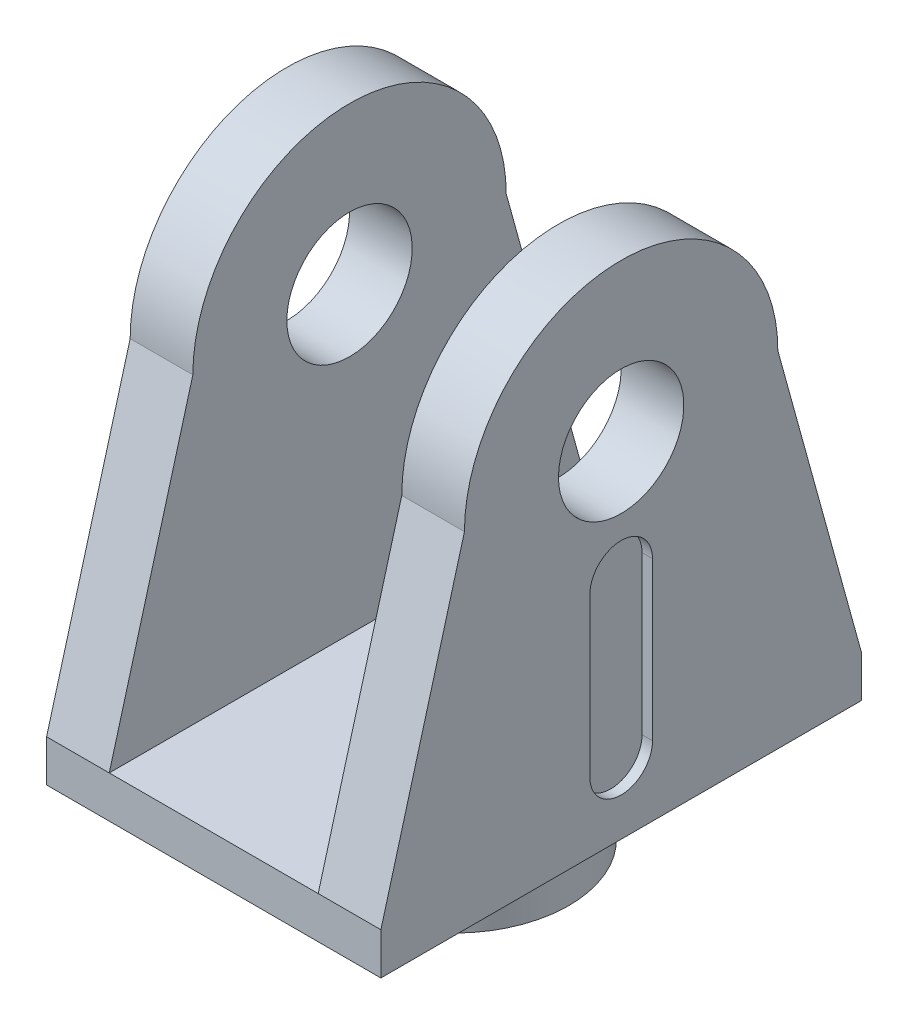
ISO-10303-21;
HEADER;
FILE_DESCRIPTION(('STEP AP214'),'2;1');
FILE_NAME('part.step','',(''),(''),'','','');
FILE_SCHEMA(('AUTOMOTIVE_DESIGN { 1 0 10303 214 1 1 1 1 }'));
ENDSEC;
DATA;
#1=APPLICATION_CONTEXT('core data for automotive mechanical design processes');
#2=APPLICATION_PROTOCOL_DEFINITION('international standard','automotive_design',2000,#1);
#3=PRODUCT_CONTEXT('',#1,'mechanical');
#4=PRODUCT('Part','Part','',(#3));
#5=PRODUCT_RELATED_PRODUCT_CATEGORY('part','',(#4));
#6=PRODUCT_DEFINITION_FORMATION('','',#4);
#7=PRODUCT_DEFINITION_CONTEXT('part definition',#1,'design');
#8=PRODUCT_DEFINITION('design','',#6,#7);
#9=PRODUCT_DEFINITION_SHAPE('','',#8);
#10=(LENGTH_UNIT() NAMED_UNIT(*) SI_UNIT(.MILLI.,.METRE.));
#11=(NAMED_UNIT(*) PLANE_ANGLE_UNIT() SI_UNIT($,.RADIAN.));
#12=(NAMED_UNIT(*) SI_UNIT($,.STERADIAN.) SOLID_ANGLE_UNIT());
#13=UNCERTAINTY_MEASURE_WITH_UNIT(LENGTH_MEASURE(1.E-05),#10,'distance_accuracy_value','');
#14=(GEOMETRIC_REPRESENTATION_CONTEXT(3) GLOBAL_UNCERTAINTY_ASSIGNED_CONTEXT((#13)) GLOBAL_UNIT_ASSIGNED_CONTEXT((#10,
#11,#12)) REPRESENTATION_CONTEXT('',''));
#15=CARTESIAN_POINT('',(0.,0.,0.));
#16=DIRECTION('',(0.,0.,1.));
#17=DIRECTION('',(1.,0.,0.));
#18=AXIS2_PLACEMENT_3D('',#15,#16,#17);
#19=CARTESIAN_POINT('',(80.,0.,115.));
#20=DIRECTION('',(-1.,0.,0.));
#21=DIRECTION('',(0.,0.,1.));
#22=AXIS2_PLACEMENT_3D('',#19,#20,#21);
#23=PLANE('',#22);
#24=CARTESIAN_POINT('',(80.,165.,0.));
#25=DIRECTION('',(-1.,0.,0.));
#26=DIRECTION('',(0.,0.,1.));
#27=AXIS2_PLACEMENT_3D('',#24,#25,#26);
#28=CIRCLE('',#27,75.);
#29=CARTESIAN_POINT('',(80.,165.,-75.));
#30=VERTEX_POINT('',#29);
#31=CARTESIAN_POINT('',(80.,165.,75.));
#32=VERTEX_POINT('',#31);
#33=EDGE_CURVE('E334',#30,#32,#28,.F.);
#34=ORIENTED_EDGE('',*,*,#33,.T.);
#35=DIRECTION('',(0.,0.963992618206074,-0.265928998125813));
#36=VECTOR('',#35,1.);
#37=CARTESIAN_POINT('',(80.,30.8950276243094,111.994475138122));
#38=LINE('',#37,#36);
#39=CARTESIAN_POINT('',(80.,20.,115.));
#40=VERTEX_POINT('',#39);
#41=EDGE_CURVE('E305',#40,#32,#38,.T.);
#42=ORIENTED_EDGE('',*,*,#41,.F.);
#43=DIRECTION('',(0.,1.,0.));
#44=VECTOR('',#43,1.);
#45=CARTESIAN_POINT('',(80.,0.,115.));
#46=LINE('',#45,#44);
#47=CARTESIAN_POINT('',(80.,0.,115.));
#48=VERTEX_POINT('',#47);
#49=EDGE_CURVE('E385',#48,#40,#46,.T.);
#50=ORIENTED_EDGE('',*,*,#49,.F.);
#51=DIRECTION('',(0.,0.,-1.));
#52=VECTOR('',#51,1.);
#53=CARTESIAN_POINT('',(80.,0.,115.));
#54=LINE('',#53,#52);
#55=CARTESIAN_POINT('',(80.,0.,-115.));
#56=VERTEX_POINT('',#55);
#57=EDGE_CURVE('E389',#48,#56,#54,.T.);
#58=ORIENTED_EDGE('',*,*,#57,.T.);
#59=DIRECTION('',(0.,1.,0.));
#60=VECTOR('',#59,1.);
#61=CARTESIAN_POINT('',(80.,0.,-115.));
#62=LINE('',#61,#60);
#63=CARTESIAN_POINT('',(80.,20.0000000000001,-115.));
#64=VERTEX_POINT('',#63);
#65=EDGE_CURVE('E379',#56,#64,#62,.T.);
#66=ORIENTED_EDGE('',*,*,#65,.T.);
#67=DIRECTION('',(0.,0.963992618206074,0.265928998125813));
#68=VECTOR('',#67,1.);
#69=CARTESIAN_POINT('',(80.,30.8950276243094,-111.994475138122));
#70=LINE('',#69,#68);
#71=EDGE_CURVE('E330',#64,#30,#70,.T.);
#72=ORIENTED_EDGE('',*,*,#71,.T.);
#73=EDGE_LOOP('',(#34,#42,#50,#58,#66,#72));
#74=FACE_BOUND('',#73,.T.);
#75=CARTESIAN_POINT('',(80.,165.,0.));
#76=DIRECTION('',(-1.,0.,0.));
#77=DIRECTION('',(0.,0.,1.));
#78=AXIS2_PLACEMENT_3D('',#75,#76,#77);
#79=CIRCLE('',#78,30.);
#80=CARTESIAN_POINT('',(80.,165.,30.));
#81=VERTEX_POINT('',#80);
#82=EDGE_CURVE('E293',#81,#81,#79,.F.);
#83=ORIENTED_EDGE('',*,*,#82,.F.);
#84=EDGE_LOOP('',(#83));
#85=FACE_BOUND('',#84,.T.);
#86=CARTESIAN_POINT('',(80.,108.832847002472,0.));
#87=DIRECTION('',(-1.,0.,0.));
#88=DIRECTION('',(0.,0.,1.));
#89=AXIS2_PLACEMENT_3D('',#86,#87,#88);
#90=CIRCLE('',#89,15.);
#91=CARTESIAN_POINT('',(80.,108.832847002472,15.));
#92=VERTEX_POINT('',#91);
#93=CARTESIAN_POINT('',(80.,108.832847002472,-15.));
#94=VERTEX_POINT('',#93);
#95=EDGE_CURVE('E88',#92,#94,#90,.T.);
#96=ORIENTED_EDGE('',*,*,#95,.T.);
#97=DIRECTION('',(0.,-1.,0.));
#98=VECTOR('',#97,1.);
#99=CARTESIAN_POINT('',(80.,108.832847002472,-15.));
#100=LINE('',#99,#98);
#101=CARTESIAN_POINT('',(80.,33.3521544358968,-15.));
#102=VERTEX_POINT('',#101);
#103=EDGE_CURVE('E220',#94,#102,#100,.T.);
#104=ORIENTED_EDGE('',*,*,#103,.T.);
#105=CARTESIAN_POINT('',(80.,33.3521544358968,0.));
#106=DIRECTION('',(-1.,0.,0.));
#107=DIRECTION('',(0.,0.,1.));
#108=AXIS2_PLACEMENT_3D('',#105,#106,#107);
#109=CIRCLE('',#108,15.);
#110=CARTESIAN_POINT('',(80.,33.3521544358968,15.));
#111=VERTEX_POINT('',#110);
#112=EDGE_CURVE('E224',#102,#111,#109,.T.);
#113=ORIENTED_EDGE('',*,*,#112,.T.);
#114=DIRECTION('',(0.,1.,0.));
#115=VECTOR('',#114,1.);
#116=CARTESIAN_POINT('',(80.,108.832847002472,15.));
#117=LINE('',#116,#115);
#118=EDGE_CURVE('E233',#111,#92,#117,.T.);
#119=ORIENTED_EDGE('',*,*,#118,.T.);
#120=EDGE_LOOP('',(#96,#104,#113,#119));
#121=FACE_BOUND('',#120,.T.);
#122=ADVANCED_FACE('F72',(#74,#85,#121),#23,.F.);
#123=CARTESIAN_POINT('',(50.,240.,115.));
#124=DIRECTION('',(1.,0.,0.));
#125=DIRECTION('',(0.,1.,0.));
#126=AXIS2_PLACEMENT_3D('',#123,#124,#125);
#127=PLANE('',#126);
#128=CARTESIAN_POINT('',(50.,165.,0.));
#129=DIRECTION('',(1.,0.,0.));
#130=DIRECTION('',(0.,1.,0.));
#131=AXIS2_PLACEMENT_3D('',#128,#129,#130);
#132=CIRCLE('',#131,30.);
#133=CARTESIAN_POINT('',(50.,195.,0.));
#134=VERTEX_POINT('',#133);
#135=EDGE_CURVE('E325',#134,#134,#132,.T.);
#136=ORIENTED_EDGE('',*,*,#135,.T.);
#137=EDGE_LOOP('',(#136));
#138=FACE_BOUND('',#137,.T.);
#139=DIRECTION('',(0.,0.963992618206074,-0.265928998125813));
#140=VECTOR('',#139,1.);
#141=CARTESIAN_POINT('',(50.,224.441988950276,58.6022099447514));
#142=LINE('',#141,#140);
#143=CARTESIAN_POINT('',(50.,20.,115.));
#144=VERTEX_POINT('',#143);
#145=CARTESIAN_POINT('',(50.,165.,75.));
#146=VERTEX_POINT('',#145);
#147=EDGE_CURVE('E317',#144,#146,#142,.T.);
#148=ORIENTED_EDGE('',*,*,#147,.T.);
#149=CARTESIAN_POINT('',(50.,165.,0.));
#150=DIRECTION('',(1.,0.,0.));
#151=DIRECTION('',(0.,1.,0.));
#152=AXIS2_PLACEMENT_3D('',#149,#150,#151);
#153=CIRCLE('',#152,75.);
#154=CARTESIAN_POINT('',(50.,165.,-75.));
#155=VERTEX_POINT('',#154);
#156=EDGE_CURVE('E361',#155,#146,#153,.T.);
#157=ORIENTED_EDGE('',*,*,#156,.F.);
#158=DIRECTION('',(0.,0.963992618206074,0.265928998125813));
#159=VECTOR('',#158,1.);
#160=CARTESIAN_POINT('',(50.,283.403314917127,-42.3370165745857));
#161=LINE('',#160,#159);
#162=CARTESIAN_POINT('',(50.,20.0000000000001,-115.));
#163=VERTEX_POINT('',#162);
#164=EDGE_CURVE('E355',#163,#155,#161,.T.);
#165=ORIENTED_EDGE('',*,*,#164,.F.);
#166=DIRECTION('',(0.,0.,-1.));
#167=VECTOR('',#166,1.);
#168=CARTESIAN_POINT('',(50.,20.,115.));
#169=LINE('',#168,#167);
#170=EDGE_CURVE('E373',#144,#163,#169,.T.);
#171=ORIENTED_EDGE('',*,*,#170,.F.);
#172=EDGE_LOOP('',(#148,#157,#165,#171));
#173=FACE_BOUND('',#172,.T.);
#174=ADVANCED_FACE('F74',(#138,#173),#127,.F.);
#175=CARTESIAN_POINT('',(-50.,240.,115.));
#176=DIRECTION('',(-1.,0.,0.));
#177=DIRECTION('',(0.,-1.,0.));
#178=AXIS2_PLACEMENT_3D('',#175,#176,#177);
#179=PLANE('',#178);
#180=CARTESIAN_POINT('',(-50.,165.,0.));
#181=DIRECTION('',(-1.,0.,0.));
#182=DIRECTION('',(0.,-1.,0.));
#183=AXIS2_PLACEMENT_3D('',#180,#181,#182);
#184=CIRCLE('',#183,30.);
#185=CARTESIAN_POINT('',(-50.,135.,0.));
#186=VERTEX_POINT('',#185);
#187=EDGE_CURVE('E321',#186,#186,#184,.T.);
#188=ORIENTED_EDGE('',*,*,#187,.T.);
#189=EDGE_LOOP('',(#188));
#190=FACE_BOUND('',#189,.T.);
#191=CARTESIAN_POINT('',(-50.,165.,0.));
#192=DIRECTION('',(-1.,0.,0.));
#193=DIRECTION('',(0.,-1.,0.));
#194=AXIS2_PLACEMENT_3D('',#191,#192,#193);
#195=CIRCLE('',#194,75.);
#196=CARTESIAN_POINT('',(-50.,165.,75.));
#197=VERTEX_POINT('',#196);
#198=CARTESIAN_POINT('',(-50.,165.,-75.));
#199=VERTEX_POINT('',#198);
#200=EDGE_CURVE('E358',#197,#199,#195,.T.);
#201=ORIENTED_EDGE('',*,*,#200,.F.);
#202=DIRECTION('',(0.,-0.963992618206074,0.265928998125813));
#203=VECTOR('',#202,1.);
#204=CARTESIAN_POINT('',(-50.,224.441988950276,58.6022099447514));
#205=LINE('',#204,#203);
#206=CARTESIAN_POINT('',(-50.,20.,115.));
#207=VERTEX_POINT('',#206);
#208=EDGE_CURVE('E313',#197,#207,#205,.T.);
#209=ORIENTED_EDGE('',*,*,#208,.T.);
#210=DIRECTION('',(0.,0.,-1.));
#211=VECTOR('',#210,1.);
#212=CARTESIAN_POINT('',(-50.,20.,115.));
#213=LINE('',#212,#211);
#214=CARTESIAN_POINT('',(-50.,20.,-115.));
#215=VERTEX_POINT('',#214);
#216=EDGE_CURVE('E409',#207,#215,#213,.T.);
#217=ORIENTED_EDGE('',*,*,#216,.T.);
#218=DIRECTION('',(0.,-0.963992618206074,-0.265928998125813));
#219=VECTOR('',#218,1.);
#220=CARTESIAN_POINT('',(-50.,283.403314917127,-42.3370165745857));
#221=LINE('',#220,#219);
#222=EDGE_CURVE('E338',#199,#215,#221,.T.);
#223=ORIENTED_EDGE('',*,*,#222,.F.);
#224=EDGE_LOOP('',(#201,#209,#217,#223));
#225=FACE_BOUND('',#224,.T.);
#226=ADVANCED_FACE('F456',(#190,#225),#179,.F.);
#227=CARTESIAN_POINT('',(-80.,0.,115.));
#228=DIRECTION('',(1.,0.,0.));
#229=DIRECTION('',(0.,0.,-1.));
#230=AXIS2_PLACEMENT_3D('',#227,#228,#229);
#231=PLANE('',#230);
#232=DIRECTION('',(0.,-1.,0.));
#233=VECTOR('',#232,1.);
#234=CARTESIAN_POINT('',(-80.,108.832847002472,-15.));
#235=LINE('',#234,#233);
#236=CARTESIAN_POINT('',(-80.,108.832847002472,-15.));
#237=VERTEX_POINT('',#236);
#238=CARTESIAN_POINT('',(-80.,33.3521544358968,-15.));
#239=VERTEX_POINT('',#238);
#240=EDGE_CURVE('E267',#237,#239,#235,.T.);
#241=ORIENTED_EDGE('',*,*,#240,.F.);
#242=CARTESIAN_POINT('',(-80.,108.832847002472,0.));
#243=DIRECTION('',(-1.,0.,0.));
#244=DIRECTION('',(0.,0.,1.));
#245=AXIS2_PLACEMENT_3D('',#242,#243,#244);
#246=CIRCLE('',#245,15.);
#247=CARTESIAN_POINT('',(-80.,108.832847002472,15.));
#248=VERTEX_POINT('',#247);
#249=EDGE_CURVE('E96',#248,#237,#246,.T.);
#250=ORIENTED_EDGE('',*,*,#249,.F.);
#251=DIRECTION('',(0.,1.,0.));
#252=VECTOR('',#251,1.);
#253=CARTESIAN_POINT('',(-80.,108.832847002472,15.));
#254=LINE('',#253,#252);
#255=CARTESIAN_POINT('',(-80.,33.3521544358968,15.));
#256=VERTEX_POINT('',#255);
#257=EDGE_CURVE('E252',#256,#248,#254,.T.);
#258=ORIENTED_EDGE('',*,*,#257,.F.);
#259=CARTESIAN_POINT('',(-80.,33.3521544358968,0.));
#260=DIRECTION('',(-1.,0.,0.));
#261=DIRECTION('',(0.,0.,1.));
#262=AXIS2_PLACEMENT_3D('',#259,#260,#261);
#263=CIRCLE('',#262,15.);
#264=EDGE_CURVE('E271',#239,#256,#263,.T.);
#265=ORIENTED_EDGE('',*,*,#264,.F.);
#266=EDGE_LOOP('',(#241,#250,#258,#265));
#267=FACE_BOUND('',#266,.T.);
#268=CARTESIAN_POINT('',(-80.,165.,0.));
#269=DIRECTION('',(-1.,0.,0.));
#270=DIRECTION('',(0.,0.,1.));
#271=AXIS2_PLACEMENT_3D('',#268,#269,#270);
#272=CIRCLE('',#271,30.);
#273=CARTESIAN_POINT('',(-80.,165.,30.));
#274=VERTEX_POINT('',#273);
#275=EDGE_CURVE('E281',#274,#274,#272,.T.);
#276=ORIENTED_EDGE('',*,*,#275,.F.);
#277=EDGE_LOOP('',(#276));
#278=FACE_BOUND('',#277,.T.);
#279=DIRECTION('',(0.,-0.963992618206074,0.265928998125813));
#280=VECTOR('',#279,1.);
#281=CARTESIAN_POINT('',(-80.,30.8950276243094,111.994475138122));
#282=LINE('',#281,#280);
#283=CARTESIAN_POINT('',(-80.,165.,75.));
#284=VERTEX_POINT('',#283);
#285=CARTESIAN_POINT('',(-80.,20.,115.));
#286=VERTEX_POINT('',#285);
#287=EDGE_CURVE('E297',#284,#286,#282,.T.);
#288=ORIENTED_EDGE('',*,*,#287,.F.);
#289=CARTESIAN_POINT('',(-80.,165.,0.));
#290=DIRECTION('',(-1.,0.,0.));
#291=DIRECTION('',(0.,0.,1.));
#292=AXIS2_PLACEMENT_3D('',#289,#290,#291);
#293=CIRCLE('',#292,75.);
#294=CARTESIAN_POINT('',(-80.,165.,-75.));
#295=VERTEX_POINT('',#294);
#296=EDGE_CURVE('E329',#284,#295,#293,.T.);
#297=ORIENTED_EDGE('',*,*,#296,.T.);
#298=DIRECTION('',(0.,-0.963992618206074,-0.265928998125813));
#299=VECTOR('',#298,1.);
#300=CARTESIAN_POINT('',(-80.,30.8950276243094,-111.994475138122));
#301=LINE('',#300,#299);
#302=CARTESIAN_POINT('',(-80.,20.0000000000001,-115.));
#303=VERTEX_POINT('',#302);
#304=EDGE_CURVE('E342',#295,#303,#301,.T.);
#305=ORIENTED_EDGE('',*,*,#304,.T.);
#306=DIRECTION('',(0.,-1.,0.));
#307=VECTOR('',#306,1.);
#308=CARTESIAN_POINT('',(-80.,0.,-115.));
#309=LINE('',#308,#307);
#310=CARTESIAN_POINT('',(-80.,0.,-115.));
#311=VERTEX_POINT('',#310);
#312=EDGE_CURVE('E393',#303,#311,#309,.T.);
#313=ORIENTED_EDGE('',*,*,#312,.T.);
#314=DIRECTION('',(0.,0.,-1.));
#315=VECTOR('',#314,1.);
#316=CARTESIAN_POINT('',(-80.,0.,115.));
#317=LINE('',#316,#315);
#318=CARTESIAN_POINT('',(-80.,0.,115.));
#319=VERTEX_POINT('',#318);
#320=EDGE_CURVE('E405',#319,#311,#317,.T.);
#321=ORIENTED_EDGE('',*,*,#320,.F.);
#322=DIRECTION('',(0.,-1.,0.));
#323=VECTOR('',#322,1.);
#324=CARTESIAN_POINT('',(-80.,0.,115.));
#325=LINE('',#324,#323);
#326=EDGE_CURVE('E378',#286,#319,#325,.T.);
#327=ORIENTED_EDGE('',*,*,#326,.F.);
#328=EDGE_LOOP('',(#288,#297,#305,#313,#321,#327));
#329=FACE_BOUND('',#328,.T.);
#330=ADVANCED_FACE('F427',(#267,#278,#329),#231,.F.);
#331=CARTESIAN_POINT('',(0.,0.,-115.));
#332=DIRECTION('',(0.,0.,1.));
#333=DIRECTION('',(1.,0.,0.));
#334=AXIS2_PLACEMENT_3D('',#331,#332,#333);
#335=PLANE('',#334);
#336=DIRECTION('',(-1.,0.,0.));
#337=VECTOR('',#336,1.);
#338=CARTESIAN_POINT('',(328.243831746128,20.0000000000001,-115.));
#339=LINE('',#338,#337);
#340=EDGE_CURVE('E346',#64,#163,#339,.T.);
#341=ORIENTED_EDGE('',*,*,#340,.F.);
#342=ORIENTED_EDGE('',*,*,#65,.F.);
#343=DIRECTION('',(1.,0.,0.));
#344=VECTOR('',#343,1.);
#345=CARTESIAN_POINT('',(80.,0.,-115.));
#346=LINE('',#345,#344);
#347=EDGE_CURVE('E396',#311,#56,#346,.T.);
#348=ORIENTED_EDGE('',*,*,#347,.F.);
#349=ORIENTED_EDGE('',*,*,#312,.F.);
#350=DIRECTION('',(-1.,0.,0.));
#351=VECTOR('',#350,1.);
#352=CARTESIAN_POINT('',(0.,20.,-115.));
#353=LINE('',#352,#351);
#354=EDGE_CURVE('E81',#215,#303,#353,.T.);
#355=ORIENTED_EDGE('',*,*,#354,.F.);
#356=DIRECTION('',(-1.,0.,0.));
#357=VECTOR('',#356,1.);
#358=CARTESIAN_POINT('',(-50.,20.,-115.));
#359=LINE('',#358,#357);
#360=EDGE_CURVE('E368',#163,#215,#359,.T.);
#361=ORIENTED_EDGE('',*,*,#360,.F.);
#362=EDGE_LOOP('',(#341,#342,#348,#349,#355,#361));
#363=FACE_BOUND('',#362,.T.);
#364=ADVANCED_FACE('F431',(#363),#335,.F.);
#365=CARTESIAN_POINT('',(-50.,20.,115.));
#366=DIRECTION('',(0.,-1.,0.));
#367=DIRECTION('',(0.,0.,-1.));
#368=AXIS2_PLACEMENT_3D('',#365,#366,#367);
#369=PLANE('',#368);
#370=ORIENTED_EDGE('',*,*,#360,.T.);
#371=ORIENTED_EDGE('',*,*,#216,.F.);
#372=DIRECTION('',(-1.,0.,0.));
#373=VECTOR('',#372,1.);
#374=CARTESIAN_POINT('',(-50.,20.,115.));
#375=LINE('',#374,#373);
#376=EDGE_CURVE('E374',#144,#207,#375,.T.);
#377=ORIENTED_EDGE('',*,*,#376,.F.);
#378=ORIENTED_EDGE('',*,*,#170,.T.);
#379=EDGE_LOOP('',(#370,#371,#377,#378));
#380=FACE_BOUND('',#379,.T.);
#381=ADVANCED_FACE('F459',(#380),#369,.F.);
#382=CARTESIAN_POINT('',(80.,0.,115.));
#383=DIRECTION('',(0.,1.,0.));
#384=DIRECTION('',(0.,0.,1.));
#385=AXIS2_PLACEMENT_3D('',#382,#383,#384);
#386=PLANE('',#385);
#387=CARTESIAN_POINT('',(0.,0.,0.));
#388=DIRECTION('',(0.,-1.,0.));
#389=DIRECTION('',(0.,0.,-1.));
#390=AXIS2_PLACEMENT_3D('',#387,#388,#389);
#391=CIRCLE('',#390,55.);
#392=CARTESIAN_POINT('',(0.,0.,-55.));
#393=VERTEX_POINT('',#392);
#394=EDGE_CURVE('E369',#393,#393,#391,.T.);
#395=ORIENTED_EDGE('',*,*,#394,.F.);
#396=EDGE_LOOP('',(#395));
#397=FACE_BOUND('',#396,.T.);
#398=ORIENTED_EDGE('',*,*,#347,.T.);
#399=ORIENTED_EDGE('',*,*,#57,.F.);
#400=DIRECTION('',(1.,0.,0.));
#401=VECTOR('',#400,1.);
#402=CARTESIAN_POINT('',(80.,0.,115.));
#403=LINE('',#402,#401);
#404=EDGE_CURVE('E382',#319,#48,#403,.T.);
#405=ORIENTED_EDGE('',*,*,#404,.F.);
#406=ORIENTED_EDGE('',*,*,#320,.T.);
#407=EDGE_LOOP('',(#398,#399,#405,#406));
#408=FACE_BOUND('',#407,.T.);
#409=ADVANCED_FACE('F435',(#397,#408),#386,.F.);
#410=CARTESIAN_POINT('',(0.,0.,115.));
#411=DIRECTION('',(0.,0.,1.));
#412=DIRECTION('',(1.,0.,0.));
#413=AXIS2_PLACEMENT_3D('',#410,#411,#412);
#414=PLANE('',#413);
#415=DIRECTION('',(1.,0.,0.));
#416=VECTOR('',#415,1.);
#417=CARTESIAN_POINT('',(0.,19.9999999999999,115.));
#418=LINE('',#417,#416);
#419=EDGE_CURVE('E12',#286,#207,#418,.T.);
#420=ORIENTED_EDGE('',*,*,#419,.F.);
#421=ORIENTED_EDGE('',*,*,#326,.T.);
#422=ORIENTED_EDGE('',*,*,#404,.T.);
#423=ORIENTED_EDGE('',*,*,#49,.T.);
#424=DIRECTION('',(-1.,0.,0.));
#425=VECTOR('',#424,1.);
#426=CARTESIAN_POINT('',(328.243831746128,20.,115.));
#427=LINE('',#426,#425);
#428=EDGE_CURVE('E301',#40,#144,#427,.T.);
#429=ORIENTED_EDGE('',*,*,#428,.T.);
#430=ORIENTED_EDGE('',*,*,#376,.T.);
#431=EDGE_LOOP('',(#420,#421,#422,#423,#429,#430));
#432=FACE_BOUND('',#431,.T.);
#433=ADVANCED_FACE('F443',(#432),#414,.T.);
#434=CARTESIAN_POINT('',(0.,-40.,0.));
#435=DIRECTION('',(0.,1.,0.));
#436=DIRECTION('',(0.,0.,1.));
#437=AXIS2_PLACEMENT_3D('',#434,#435,#436);
#438=CYLINDRICAL_SURFACE('',#437,55.);
#439=CARTESIAN_POINT('',(0.,-40.,0.));
#440=DIRECTION('',(0.,-1.,0.));
#441=DIRECTION('',(0.,0.,-1.));
#442=AXIS2_PLACEMENT_3D('',#439,#440,#441);
#443=CIRCLE('',#442,55.);
#444=CARTESIAN_POINT('',(0.,-40.,-55.));
#445=VERTEX_POINT('',#444);
#446=EDGE_CURVE('E364',#445,#445,#443,.T.);
#447=ORIENTED_EDGE('',*,*,#446,.F.);
#448=EDGE_LOOP('',(#447));
#449=FACE_BOUND('',#448,.T.);
#450=ORIENTED_EDGE('',*,*,#394,.T.);
#451=EDGE_LOOP('',(#450));
#452=FACE_BOUND('',#451,.T.);
#453=ADVANCED_FACE('F535',(#449,#452),#438,.T.);
#454=CARTESIAN_POINT('',(0.,-40.,0.));
#455=DIRECTION('',(0.,-1.,0.));
#456=DIRECTION('',(0.,0.,-1.));
#457=AXIS2_PLACEMENT_3D('',#454,#455,#456);
#458=PLANE('',#457);
#459=ORIENTED_EDGE('',*,*,#446,.T.);
#460=EDGE_LOOP('',(#459));
#461=FACE_BOUND('',#460,.T.);
#462=ADVANCED_FACE('F530',(#461),#458,.T.);
#463=CARTESIAN_POINT('',(328.243831746128,30.8950276243094,-111.994475138122));
#464=DIRECTION('',(0.,0.265928998125813,-0.963992618206074));
#465=DIRECTION('',(0.,0.963992618206074,0.265928998125813));
#466=AXIS2_PLACEMENT_3D('',#463,#464,#465);
#467=PLANE('',#466);
#468=ORIENTED_EDGE('',*,*,#222,.T.);
#469=ORIENTED_EDGE('',*,*,#354,.T.);
#470=ORIENTED_EDGE('',*,*,#304,.F.);
#471=DIRECTION('',(-1.,0.,0.));
#472=VECTOR('',#471,1.);
#473=CARTESIAN_POINT('',(328.243831746128,165.,-75.));
#474=LINE('',#473,#472);
#475=EDGE_CURVE('E350',#199,#295,#474,.T.);
#476=ORIENTED_EDGE('',*,*,#475,.F.);
#477=EDGE_LOOP('',(#468,#469,#470,#476));
#478=FACE_BOUND('',#477,.T.);
#479=ADVANCED_FACE('F419',(#478),#467,.T.);
#480=CARTESIAN_POINT('',(328.243831746128,165.,0.));
#481=DIRECTION('',(-1.,0.,0.));
#482=DIRECTION('',(0.,0.,1.));
#483=AXIS2_PLACEMENT_3D('',#480,#481,#482);
#484=CYLINDRICAL_SURFACE('',#483,75.);
#485=ORIENTED_EDGE('',*,*,#200,.T.);
#486=ORIENTED_EDGE('',*,*,#475,.T.);
#487=ORIENTED_EDGE('',*,*,#296,.F.);
#488=DIRECTION('',(-1.,0.,0.));
#489=VECTOR('',#488,1.);
#490=CARTESIAN_POINT('',(328.243831746128,165.,75.));
#491=LINE('',#490,#489);
#492=EDGE_CURVE('E300',#197,#284,#491,.T.);
#493=ORIENTED_EDGE('',*,*,#492,.F.);
#494=EDGE_LOOP('',(#485,#486,#487,#493));
#495=FACE_BOUND('',#494,.T.);
#496=ADVANCED_FACE('F454',(#495),#484,.T.);
#497=ORIENTED_EDGE('',*,*,#156,.T.);
#498=EDGE_CURVE('E306',#32,#146,#491,.T.);
#499=ORIENTED_EDGE('',*,*,#498,.F.);
#500=ORIENTED_EDGE('',*,*,#33,.F.);
#501=EDGE_CURVE('E335',#30,#155,#474,.T.);
#502=ORIENTED_EDGE('',*,*,#501,.T.);
#503=EDGE_LOOP('',(#497,#499,#500,#502));
#504=FACE_BOUND('',#503,.T.);
#505=ADVANCED_FACE('F469',(#504),#484,.T.);
#506=ORIENTED_EDGE('',*,*,#164,.T.);
#507=ORIENTED_EDGE('',*,*,#501,.F.);
#508=ORIENTED_EDGE('',*,*,#71,.F.);
#509=ORIENTED_EDGE('',*,*,#340,.T.);
#510=EDGE_LOOP('',(#506,#507,#508,#509));
#511=FACE_BOUND('',#510,.T.);
#512=ADVANCED_FACE('F463',(#511),#467,.T.);
#513=CARTESIAN_POINT('',(328.243831746128,30.8950276243094,111.994475138122));
#514=DIRECTION('',(0.,-0.265928998125813,-0.963992618206074));
#515=DIRECTION('',(0.,0.963992618206074,-0.265928998125813));
#516=AXIS2_PLACEMENT_3D('',#513,#514,#515);
#517=PLANE('',#516);
#518=ORIENTED_EDGE('',*,*,#428,.F.);
#519=ORIENTED_EDGE('',*,*,#41,.T.);
#520=ORIENTED_EDGE('',*,*,#498,.T.);
#521=ORIENTED_EDGE('',*,*,#147,.F.);
#522=EDGE_LOOP('',(#518,#519,#520,#521));
#523=FACE_BOUND('',#522,.T.);
#524=ADVANCED_FACE('F471',(#523),#517,.F.);
#525=ORIENTED_EDGE('',*,*,#492,.T.);
#526=ORIENTED_EDGE('',*,*,#287,.T.);
#527=ORIENTED_EDGE('',*,*,#419,.T.);
#528=ORIENTED_EDGE('',*,*,#208,.F.);
#529=EDGE_LOOP('',(#525,#526,#527,#528));
#530=FACE_BOUND('',#529,.T.);
#531=ADVANCED_FACE('F448',(#530),#517,.F.);
#532=CARTESIAN_POINT('',(328.243831746128,165.,0.));
#533=DIRECTION('',(-1.,0.,0.));
#534=DIRECTION('',(0.,0.,1.));
#535=AXIS2_PLACEMENT_3D('',#532,#533,#534);
#536=CYLINDRICAL_SURFACE('',#535,30.);
#537=ORIENTED_EDGE('',*,*,#82,.T.);
#538=EDGE_LOOP('',(#537));
#539=FACE_BOUND('',#538,.T.);
#540=ORIENTED_EDGE('',*,*,#135,.F.);
#541=EDGE_LOOP('',(#540));
#542=FACE_BOUND('',#541,.T.);
#543=ADVANCED_FACE('F478',(#539,#542),#536,.F.);
#544=ORIENTED_EDGE('',*,*,#275,.T.);
#545=EDGE_LOOP('',(#544));
#546=FACE_BOUND('',#545,.T.);
#547=ORIENTED_EDGE('',*,*,#187,.F.);
#548=EDGE_LOOP('',(#547));
#549=FACE_BOUND('',#548,.T.);
#550=ADVANCED_FACE('F615',(#546,#549),#536,.F.);
#551=CARTESIAN_POINT('',(-75.,108.832847002472,0.));
#552=DIRECTION('',(-1.,0.,0.));
#553=DIRECTION('',(0.,0.,1.));
#554=AXIS2_PLACEMENT_3D('',#551,#552,#553);
#555=CYLINDRICAL_SURFACE('',#554,15.);
#556=ORIENTED_EDGE('',*,*,#249,.T.);
#557=DIRECTION('',(-1.,0.,0.));
#558=VECTOR('',#557,1.);
#559=CARTESIAN_POINT('',(-75.,108.832847002472,-15.));
#560=LINE('',#559,#558);
#561=CARTESIAN_POINT('',(-75.,108.832847002472,-15.));
#562=VERTEX_POINT('',#561);
#563=EDGE_CURVE('E264',#562,#237,#560,.T.);
#564=ORIENTED_EDGE('',*,*,#563,.F.);
#565=CARTESIAN_POINT('',(-75.,108.832847002472,0.));
#566=DIRECTION('',(-1.,0.,0.));
#567=DIRECTION('',(0.,0.,1.));
#568=AXIS2_PLACEMENT_3D('',#565,#566,#567);
#569=CIRCLE('',#568,15.);
#570=CARTESIAN_POINT('',(-75.,108.832847002472,15.));
#571=VERTEX_POINT('',#570);
#572=EDGE_CURVE('E247',#571,#562,#569,.T.);
#573=ORIENTED_EDGE('',*,*,#572,.F.);
#574=DIRECTION('',(-1.,0.,0.));
#575=VECTOR('',#574,1.);
#576=CARTESIAN_POINT('',(-75.,108.832847002472,15.));
#577=LINE('',#576,#575);
#578=EDGE_CURVE('E278',#571,#248,#577,.T.);
#579=ORIENTED_EDGE('',*,*,#578,.T.);
#580=EDGE_LOOP('',(#556,#564,#573,#579));
#581=FACE_BOUND('',#580,.T.);
#582=ADVANCED_FACE('F624',(#581),#555,.F.);
#583=CARTESIAN_POINT('',(-75.,108.832847002472,15.));
#584=DIRECTION('',(0.,0.,1.));
#585=DIRECTION('',(0.,-1.,0.));
#586=AXIS2_PLACEMENT_3D('',#583,#584,#585);
#587=PLANE('',#586);
#588=ORIENTED_EDGE('',*,*,#257,.T.);
#589=ORIENTED_EDGE('',*,*,#578,.F.);
#590=DIRECTION('',(0.,1.,0.));
#591=VECTOR('',#590,1.);
#592=CARTESIAN_POINT('',(-75.,108.832847002472,15.));
#593=LINE('',#592,#591);
#594=CARTESIAN_POINT('',(-75.,33.3521544358968,15.));
#595=VERTEX_POINT('',#594);
#596=EDGE_CURVE('E260',#595,#571,#593,.T.);
#597=ORIENTED_EDGE('',*,*,#596,.F.);
#598=DIRECTION('',(-1.,0.,0.));
#599=VECTOR('',#598,1.);
#600=CARTESIAN_POINT('',(-75.,33.3521544358968,15.));
#601=LINE('',#600,#599);
#602=EDGE_CURVE('E282',#595,#256,#601,.T.);
#603=ORIENTED_EDGE('',*,*,#602,.T.);
#604=EDGE_LOOP('',(#588,#589,#597,#603));
#605=FACE_BOUND('',#604,.T.);
#606=ADVANCED_FACE('F641',(#605),#587,.F.);
#607=CARTESIAN_POINT('',(-75.,33.3521544358968,0.));
#608=DIRECTION('',(-1.,0.,0.));
#609=DIRECTION('',(0.,0.,1.));
#610=AXIS2_PLACEMENT_3D('',#607,#608,#609);
#611=CYLINDRICAL_SURFACE('',#610,15.);
#612=ORIENTED_EDGE('',*,*,#264,.T.);
#613=ORIENTED_EDGE('',*,*,#602,.F.);
#614=CARTESIAN_POINT('',(-75.,33.3521544358968,0.));
#615=DIRECTION('',(-1.,0.,0.));
#616=DIRECTION('',(0.,0.,1.));
#617=AXIS2_PLACEMENT_3D('',#614,#615,#616);
#618=CIRCLE('',#617,15.);
#619=CARTESIAN_POINT('',(-75.,33.3521544358968,-15.));
#620=VERTEX_POINT('',#619);
#621=EDGE_CURVE('E256',#620,#595,#618,.T.);
#622=ORIENTED_EDGE('',*,*,#621,.F.);
#623=DIRECTION('',(-1.,0.,0.));
#624=VECTOR('',#623,1.);
#625=CARTESIAN_POINT('',(-75.,33.3521544358968,-15.));
#626=LINE('',#625,#624);
#627=EDGE_CURVE('E285',#620,#239,#626,.T.);
#628=ORIENTED_EDGE('',*,*,#627,.T.);
#629=EDGE_LOOP('',(#612,#613,#622,#628));
#630=FACE_BOUND('',#629,.T.);
#631=ADVANCED_FACE('F647',(#630),#611,.F.);
#632=CARTESIAN_POINT('',(-75.,108.832847002472,-15.));
#633=DIRECTION('',(0.,0.,-1.));
#634=DIRECTION('',(0.,1.,0.));
#635=AXIS2_PLACEMENT_3D('',#632,#633,#634);
#636=PLANE('',#635);
#637=ORIENTED_EDGE('',*,*,#240,.T.);
#638=ORIENTED_EDGE('',*,*,#627,.F.);
#639=DIRECTION('',(0.,-1.,0.));
#640=VECTOR('',#639,1.);
#641=CARTESIAN_POINT('',(-75.,108.832847002472,-15.));
#642=LINE('',#641,#640);
#643=EDGE_CURVE('E251',#562,#620,#642,.T.);
#644=ORIENTED_EDGE('',*,*,#643,.F.);
#645=ORIENTED_EDGE('',*,*,#563,.T.);
#646=EDGE_LOOP('',(#637,#638,#644,#645));
#647=FACE_BOUND('',#646,.T.);
#648=ADVANCED_FACE('F655',(#647),#636,.F.);
#649=CARTESIAN_POINT('',(-75.,108.832847002472,0.));
#650=DIRECTION('',(-1.,0.,0.));
#651=DIRECTION('',(0.,0.,1.));
#652=AXIS2_PLACEMENT_3D('',#649,#650,#651);
#653=PLANE('',#652);
#654=ORIENTED_EDGE('',*,*,#572,.T.);
#655=ORIENTED_EDGE('',*,*,#643,.T.);
#656=ORIENTED_EDGE('',*,*,#621,.T.);
#657=ORIENTED_EDGE('',*,*,#596,.T.);
#658=EDGE_LOOP('',(#654,#655,#656,#657));
#659=FACE_BOUND('',#658,.T.);
#660=ADVANCED_FACE('F663',(#659),#653,.T.);
#661=CARTESIAN_POINT('',(75.,108.832847002472,0.));
#662=DIRECTION('',(1.,0.,0.));
#663=DIRECTION('',(0.,0.,-1.));
#664=AXIS2_PLACEMENT_3D('',#661,#662,#663);
#665=CYLINDRICAL_SURFACE('',#664,15.);
#666=ORIENTED_EDGE('',*,*,#95,.F.);
#667=DIRECTION('',(1.,0.,0.));
#668=VECTOR('',#667,1.);
#669=CARTESIAN_POINT('',(75.,108.832847002472,15.));
#670=LINE('',#669,#668);
#671=CARTESIAN_POINT('',(75.,108.832847002472,15.));
#672=VERTEX_POINT('',#671);
#673=EDGE_CURVE('E202',#672,#92,#670,.T.);
#674=ORIENTED_EDGE('',*,*,#673,.F.);
#675=CARTESIAN_POINT('',(75.,108.832847002472,0.));
#676=DIRECTION('',(-1.,0.,0.));
#677=DIRECTION('',(0.,0.,1.));
#678=AXIS2_PLACEMENT_3D('',#675,#676,#677);
#679=CIRCLE('',#678,15.);
#680=CARTESIAN_POINT('',(75.,108.832847002472,-15.));
#681=VERTEX_POINT('',#680);
#682=EDGE_CURVE('E210',#672,#681,#679,.T.);
#683=ORIENTED_EDGE('',*,*,#682,.T.);
#684=DIRECTION('',(1.,0.,0.));
#685=VECTOR('',#684,1.);
#686=CARTESIAN_POINT('',(75.,108.832847002472,-15.));
#687=LINE('',#686,#685);
#688=EDGE_CURVE('E239',#681,#94,#687,.T.);
#689=ORIENTED_EDGE('',*,*,#688,.T.);
#690=EDGE_LOOP('',(#666,#674,#683,#689));
#691=FACE_BOUND('',#690,.T.);
#692=ADVANCED_FACE('F213',(#691),#665,.F.);
#693=CARTESIAN_POINT('',(75.,108.832847002472,-15.));
#694=DIRECTION('',(0.,0.,1.));
#695=DIRECTION('',(0.,-1.,0.));
#696=AXIS2_PLACEMENT_3D('',#693,#694,#695);
#697=PLANE('',#696);
#698=ORIENTED_EDGE('',*,*,#103,.F.);
#699=ORIENTED_EDGE('',*,*,#688,.F.);
#700=DIRECTION('',(0.,-1.,0.));
#701=VECTOR('',#700,1.);
#702=CARTESIAN_POINT('',(75.,108.832847002472,-15.));
#703=LINE('',#702,#701);
#704=CARTESIAN_POINT('',(75.,33.3521544358968,-15.));
#705=VERTEX_POINT('',#704);
#706=EDGE_CURVE('E216',#681,#705,#703,.T.);
#707=ORIENTED_EDGE('',*,*,#706,.T.);
#708=DIRECTION('',(1.,0.,0.));
#709=VECTOR('',#708,1.);
#710=CARTESIAN_POINT('',(75.,33.3521544358968,-15.));
#711=LINE('',#710,#709);
#712=EDGE_CURVE('E242',#705,#102,#711,.T.);
#713=ORIENTED_EDGE('',*,*,#712,.T.);
#714=EDGE_LOOP('',(#698,#699,#707,#713));
#715=FACE_BOUND('',#714,.T.);
#716=ADVANCED_FACE('F675',(#715),#697,.T.);
#717=CARTESIAN_POINT('',(75.,33.3521544358968,0.));
#718=DIRECTION('',(1.,0.,0.));
#719=DIRECTION('',(0.,0.,-1.));
#720=AXIS2_PLACEMENT_3D('',#717,#718,#719);
#721=CYLINDRICAL_SURFACE('',#720,15.);
#722=ORIENTED_EDGE('',*,*,#112,.F.);
#723=ORIENTED_EDGE('',*,*,#712,.F.);
#724=CARTESIAN_POINT('',(75.,33.3521544358968,0.));
#725=DIRECTION('',(-1.,0.,0.));
#726=DIRECTION('',(0.,0.,1.));
#727=AXIS2_PLACEMENT_3D('',#724,#725,#726);
#728=CIRCLE('',#727,15.);
#729=CARTESIAN_POINT('',(75.,33.3521544358968,15.));
#730=VERTEX_POINT('',#729);
#731=EDGE_CURVE('E209',#705,#730,#728,.T.);
#732=ORIENTED_EDGE('',*,*,#731,.T.);
#733=DIRECTION('',(1.,0.,0.));
#734=VECTOR('',#733,1.);
#735=CARTESIAN_POINT('',(75.,33.3521544358968,15.));
#736=LINE('',#735,#734);
#737=EDGE_CURVE('E204',#730,#111,#736,.T.);
#738=ORIENTED_EDGE('',*,*,#737,.T.);
#739=EDGE_LOOP('',(#722,#723,#732,#738));
#740=FACE_BOUND('',#739,.T.);
#741=ADVANCED_FACE('F681',(#740),#721,.F.);
#742=CARTESIAN_POINT('',(75.,108.832847002472,15.));
#743=DIRECTION('',(0.,0.,-1.));
#744=DIRECTION('',(0.,1.,0.));
#745=AXIS2_PLACEMENT_3D('',#742,#743,#744);
#746=PLANE('',#745);
#747=ORIENTED_EDGE('',*,*,#118,.F.);
#748=ORIENTED_EDGE('',*,*,#737,.F.);
#749=DIRECTION('',(0.,1.,0.));
#750=VECTOR('',#749,1.);
#751=CARTESIAN_POINT('',(75.,108.832847002472,15.));
#752=LINE('',#751,#750);
#753=EDGE_CURVE('E199',#730,#672,#752,.T.);
#754=ORIENTED_EDGE('',*,*,#753,.T.);
#755=ORIENTED_EDGE('',*,*,#673,.T.);
#756=EDGE_LOOP('',(#747,#748,#754,#755));
#757=FACE_BOUND('',#756,.T.);
#758=ADVANCED_FACE('F201',(#757),#746,.T.);
#759=CARTESIAN_POINT('',(75.,108.832847002472,0.));
#760=DIRECTION('',(1.,0.,0.));
#761=DIRECTION('',(0.,0.,1.));
#762=AXIS2_PLACEMENT_3D('',#759,#760,#761);
#763=PLANE('',#762);
#764=ORIENTED_EDGE('',*,*,#682,.F.);
#765=ORIENTED_EDGE('',*,*,#753,.F.);
#766=ORIENTED_EDGE('',*,*,#731,.F.);
#767=ORIENTED_EDGE('',*,*,#706,.F.);
#768=EDGE_LOOP('',(#764,#765,#766,#767));
#769=FACE_BOUND('',#768,.T.);
#770=ADVANCED_FACE('F218',(#769),#763,.T.);
#771=CLOSED_SHELL('',(#122,#174,#226,#330,#364,#381,#409,#433,#453,#462,#479,#496,#505,#512,
#524,#531,#543,#550,#582,#606,#631,#648,#660,#692,#716,#741,#758,#770));
#772=MANIFOLD_SOLID_BREP('B2',#771);
#773=ADVANCED_BREP_SHAPE_REPRESENTATION('',(#18,#772),#14);
#774=SHAPE_DEFINITION_REPRESENTATION(#9,#773);
ENDSEC;
END-ISO-10303-21;
